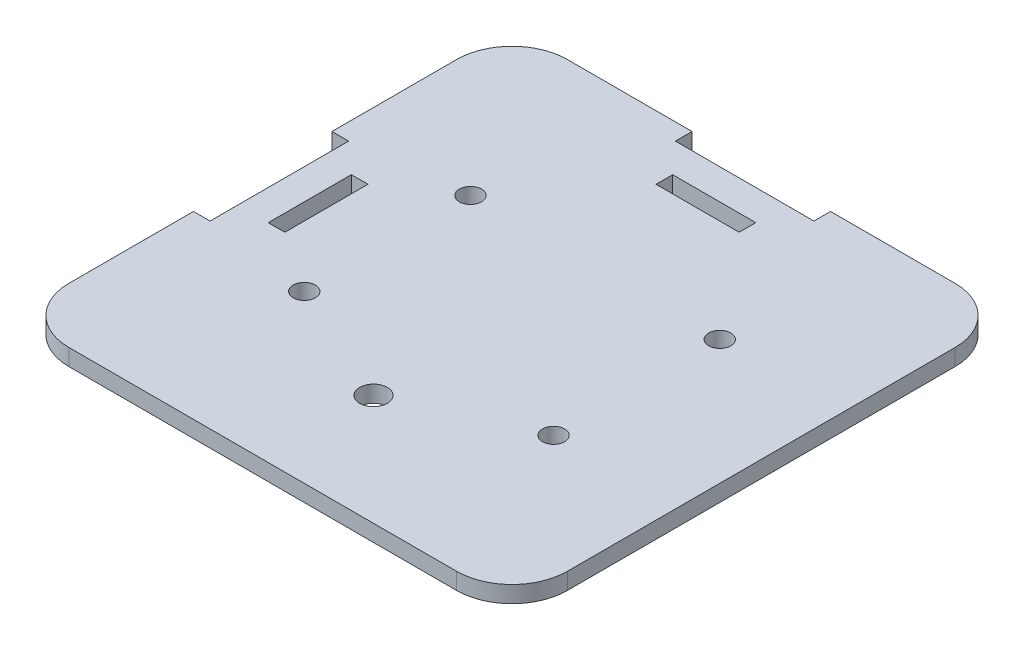
ISO-10303-21;
HEADER;
FILE_DESCRIPTION(('STEP AP214'),'2;1');
FILE_NAME('part.step','',(''),(''),'','','');
FILE_SCHEMA(('AUTOMOTIVE_DESIGN { 1 0 10303 214 1 1 1 1 }'));
ENDSEC;
DATA;
#1=APPLICATION_CONTEXT('core data for automotive mechanical design processes');
#2=APPLICATION_PROTOCOL_DEFINITION('international standard','automotive_design',2000,#1);
#3=PRODUCT_CONTEXT('',#1,'mechanical');
#4=PRODUCT('Part','Part','',(#3));
#5=PRODUCT_RELATED_PRODUCT_CATEGORY('part','',(#4));
#6=PRODUCT_DEFINITION_FORMATION('','',#4);
#7=PRODUCT_DEFINITION_CONTEXT('part definition',#1,'design');
#8=PRODUCT_DEFINITION('design','',#6,#7);
#9=PRODUCT_DEFINITION_SHAPE('','',#8);
#10=(LENGTH_UNIT() NAMED_UNIT(*) SI_UNIT(.MILLI.,.METRE.));
#11=(NAMED_UNIT(*) PLANE_ANGLE_UNIT() SI_UNIT($,.RADIAN.));
#12=(NAMED_UNIT(*) SI_UNIT($,.STERADIAN.) SOLID_ANGLE_UNIT());
#13=UNCERTAINTY_MEASURE_WITH_UNIT(LENGTH_MEASURE(1.E-05),#10,'distance_accuracy_value','');
#14=(GEOMETRIC_REPRESENTATION_CONTEXT(3) GLOBAL_UNCERTAINTY_ASSIGNED_CONTEXT((#13)) GLOBAL_UNIT_ASSIGNED_CONTEXT((#10,
#11,#12)) REPRESENTATION_CONTEXT('',''));
#15=CARTESIAN_POINT('',(0.,0.,0.));
#16=DIRECTION('',(0.,0.,1.));
#17=DIRECTION('',(1.,0.,0.));
#18=AXIS2_PLACEMENT_3D('',#15,#16,#17);
#19=CARTESIAN_POINT('',(-35.,3.,-35.));
#20=DIRECTION('',(0.,-1.,0.));
#21=DIRECTION('',(0.,0.,-1.));
#22=AXIS2_PLACEMENT_3D('',#19,#20,#21);
#23=CYLINDRICAL_SURFACE('',#22,10.);
#24=CARTESIAN_POINT('',(-35.,0.,-35.));
#25=DIRECTION('',(0.,1.,0.));
#26=DIRECTION('',(0.,0.,1.));
#27=AXIS2_PLACEMENT_3D('',#24,#25,#26);
#28=CIRCLE('',#27,10.);
#29=CARTESIAN_POINT('',(-45.,0.,-35.));
#30=VERTEX_POINT('',#29);
#31=CARTESIAN_POINT('',(-35.,0.,-45.));
#32=VERTEX_POINT('',#31);
#33=EDGE_CURVE('E269',#30,#32,#28,.F.);
#34=ORIENTED_EDGE('',*,*,#33,.F.);
#35=DIRECTION('',(0.,-1.,0.));
#36=VECTOR('',#35,1.);
#37=CARTESIAN_POINT('',(-45.,3.,-35.));
#38=LINE('',#37,#36);
#39=CARTESIAN_POINT('',(-45.,3.,-35.));
#40=VERTEX_POINT('',#39);
#41=EDGE_CURVE('E381',#40,#30,#38,.T.);
#42=ORIENTED_EDGE('',*,*,#41,.F.);
#43=CARTESIAN_POINT('',(-35.,3.,-35.));
#44=DIRECTION('',(0.,1.,0.));
#45=DIRECTION('',(0.,0.,1.));
#46=AXIS2_PLACEMENT_3D('',#43,#44,#45);
#47=CIRCLE('',#46,10.);
#48=CARTESIAN_POINT('',(-35.,3.,-45.));
#49=VERTEX_POINT('',#48);
#50=EDGE_CURVE('E272',#40,#49,#47,.F.);
#51=ORIENTED_EDGE('',*,*,#50,.T.);
#52=DIRECTION('',(0.,-1.,0.));
#53=VECTOR('',#52,1.);
#54=CARTESIAN_POINT('',(-35.,3.,-45.));
#55=LINE('',#54,#53);
#56=EDGE_CURVE('E346',#49,#32,#55,.T.);
#57=ORIENTED_EDGE('',*,*,#56,.T.);
#58=EDGE_LOOP('',(#34,#42,#51,#57));
#59=FACE_BOUND('',#58,.T.);
#60=ADVANCED_FACE('F35',(#59),#23,.T.);
#61=CARTESIAN_POINT('',(-45.,3.,0.));
#62=DIRECTION('',(-1.,0.,0.));
#63=DIRECTION('',(0.,0.,1.));
#64=AXIS2_PLACEMENT_3D('',#61,#62,#63);
#65=PLANE('',#64);
#66=DIRECTION('',(0.,0.,-1.));
#67=VECTOR('',#66,1.);
#68=CARTESIAN_POINT('',(-45.,0.,0.));
#69=LINE('',#68,#67);
#70=CARTESIAN_POINT('',(-45.,0.,-12.5));
#71=VERTEX_POINT('',#70);
#72=EDGE_CURVE('E311',#71,#30,#69,.T.);
#73=ORIENTED_EDGE('',*,*,#72,.F.);
#74=DIRECTION('',(0.,-1.,0.));
#75=VECTOR('',#74,1.);
#76=CARTESIAN_POINT('',(-45.,3.,-12.5));
#77=LINE('',#76,#75);
#78=CARTESIAN_POINT('',(-45.,3.,-12.5));
#79=VERTEX_POINT('',#78);
#80=EDGE_CURVE('E379',#79,#71,#77,.T.);
#81=ORIENTED_EDGE('',*,*,#80,.F.);
#82=DIRECTION('',(0.,0.,-1.));
#83=VECTOR('',#82,1.);
#84=CARTESIAN_POINT('',(-45.,3.,0.));
#85=LINE('',#84,#83);
#86=EDGE_CURVE('E275',#79,#40,#85,.T.);
#87=ORIENTED_EDGE('',*,*,#86,.T.);
#88=ORIENTED_EDGE('',*,*,#41,.T.);
#89=EDGE_LOOP('',(#73,#81,#87,#88));
#90=FACE_BOUND('',#89,.T.);
#91=ADVANCED_FACE('F420',(#90),#65,.T.);
#92=CARTESIAN_POINT('',(0.,3.,-12.5));
#93=DIRECTION('',(0.,0.,-1.));
#94=DIRECTION('',(-1.,0.,0.));
#95=AXIS2_PLACEMENT_3D('',#92,#93,#94);
#96=PLANE('',#95);
#97=DIRECTION('',(1.,0.,0.));
#98=VECTOR('',#97,1.);
#99=CARTESIAN_POINT('',(0.,0.,-12.5));
#100=LINE('',#99,#98);
#101=CARTESIAN_POINT('',(-42.,0.,-12.5));
#102=VERTEX_POINT('',#101);
#103=EDGE_CURVE('E314',#71,#102,#100,.T.);
#104=ORIENTED_EDGE('',*,*,#103,.T.);
#105=DIRECTION('',(0.,-1.,0.));
#106=VECTOR('',#105,1.);
#107=CARTESIAN_POINT('',(-42.,3.,-12.5));
#108=LINE('',#107,#106);
#109=CARTESIAN_POINT('',(-42.,3.,-12.5));
#110=VERTEX_POINT('',#109);
#111=EDGE_CURVE('E376',#110,#102,#108,.T.);
#112=ORIENTED_EDGE('',*,*,#111,.F.);
#113=DIRECTION('',(1.,0.,0.));
#114=VECTOR('',#113,1.);
#115=CARTESIAN_POINT('',(0.,3.,-12.5));
#116=LINE('',#115,#114);
#117=EDGE_CURVE('E279',#79,#110,#116,.T.);
#118=ORIENTED_EDGE('',*,*,#117,.F.);
#119=ORIENTED_EDGE('',*,*,#80,.T.);
#120=EDGE_LOOP('',(#104,#112,#118,#119));
#121=FACE_BOUND('',#120,.T.);
#122=ADVANCED_FACE('F425',(#121),#96,.F.);
#123=CARTESIAN_POINT('',(-42.,3.,0.));
#124=DIRECTION('',(1.,0.,0.));
#125=DIRECTION('',(0.,0.,-1.));
#126=AXIS2_PLACEMENT_3D('',#123,#124,#125);
#127=PLANE('',#126);
#128=DIRECTION('',(0.,0.,1.));
#129=VECTOR('',#128,1.);
#130=CARTESIAN_POINT('',(-42.,0.,0.));
#131=LINE('',#130,#129);
#132=CARTESIAN_POINT('',(-42.,0.,12.5));
#133=VERTEX_POINT('',#132);
#134=EDGE_CURVE('E317',#102,#133,#131,.T.);
#135=ORIENTED_EDGE('',*,*,#134,.T.);
#136=DIRECTION('',(0.,-1.,0.));
#137=VECTOR('',#136,1.);
#138=CARTESIAN_POINT('',(-42.,3.,12.5));
#139=LINE('',#138,#137);
#140=CARTESIAN_POINT('',(-42.,3.,12.5));
#141=VERTEX_POINT('',#140);
#142=EDGE_CURVE('E374',#141,#133,#139,.T.);
#143=ORIENTED_EDGE('',*,*,#142,.F.);
#144=DIRECTION('',(0.,0.,1.));
#145=VECTOR('',#144,1.);
#146=CARTESIAN_POINT('',(-42.,3.,0.));
#147=LINE('',#146,#145);
#148=EDGE_CURVE('E282',#110,#141,#147,.T.);
#149=ORIENTED_EDGE('',*,*,#148,.F.);
#150=ORIENTED_EDGE('',*,*,#111,.T.);
#151=EDGE_LOOP('',(#135,#143,#149,#150));
#152=FACE_BOUND('',#151,.T.);
#153=ADVANCED_FACE('F497',(#152),#127,.F.);
#154=CARTESIAN_POINT('',(0.,3.,12.5));
#155=DIRECTION('',(0.,0.,-1.));
#156=DIRECTION('',(-1.,0.,0.));
#157=AXIS2_PLACEMENT_3D('',#154,#155,#156);
#158=PLANE('',#157);
#159=DIRECTION('',(1.,0.,0.));
#160=VECTOR('',#159,1.);
#161=CARTESIAN_POINT('',(0.,0.,12.5));
#162=LINE('',#161,#160);
#163=CARTESIAN_POINT('',(-45.,0.,12.5));
#164=VERTEX_POINT('',#163);
#165=EDGE_CURVE('E320',#164,#133,#162,.T.);
#166=ORIENTED_EDGE('',*,*,#165,.F.);
#167=DIRECTION('',(0.,-1.,0.));
#168=VECTOR('',#167,1.);
#169=CARTESIAN_POINT('',(-45.,3.,12.5));
#170=LINE('',#169,#168);
#171=CARTESIAN_POINT('',(-45.,3.,12.5));
#172=VERTEX_POINT('',#171);
#173=EDGE_CURVE('E372',#172,#164,#170,.T.);
#174=ORIENTED_EDGE('',*,*,#173,.F.);
#175=DIRECTION('',(1.,0.,0.));
#176=VECTOR('',#175,1.);
#177=CARTESIAN_POINT('',(0.,3.,12.5));
#178=LINE('',#177,#176);
#179=EDGE_CURVE('E284',#172,#141,#178,.T.);
#180=ORIENTED_EDGE('',*,*,#179,.T.);
#181=ORIENTED_EDGE('',*,*,#142,.T.);
#182=EDGE_LOOP('',(#166,#174,#180,#181));
#183=FACE_BOUND('',#182,.T.);
#184=ADVANCED_FACE('F494',(#183),#158,.T.);
#185=CARTESIAN_POINT('',(-45.,0.,35.));
#186=VERTEX_POINT('',#185);
#187=EDGE_CURVE('E315',#186,#164,#69,.T.);
#188=ORIENTED_EDGE('',*,*,#187,.F.);
#189=DIRECTION('',(0.,-1.,0.));
#190=VECTOR('',#189,1.);
#191=CARTESIAN_POINT('',(-45.,3.,35.));
#192=LINE('',#191,#190);
#193=CARTESIAN_POINT('',(-45.,3.,35.));
#194=VERTEX_POINT('',#193);
#195=EDGE_CURVE('E370',#194,#186,#192,.T.);
#196=ORIENTED_EDGE('',*,*,#195,.F.);
#197=EDGE_CURVE('E280',#194,#172,#85,.T.);
#198=ORIENTED_EDGE('',*,*,#197,.T.);
#199=ORIENTED_EDGE('',*,*,#173,.T.);
#200=EDGE_LOOP('',(#188,#196,#198,#199));
#201=FACE_BOUND('',#200,.T.);
#202=ADVANCED_FACE('F428',(#201),#65,.T.);
#203=CARTESIAN_POINT('',(-35.,3.,35.));
#204=DIRECTION('',(0.,-1.,0.));
#205=DIRECTION('',(0.,0.,-1.));
#206=AXIS2_PLACEMENT_3D('',#203,#204,#205);
#207=CYLINDRICAL_SURFACE('',#206,10.);
#208=CARTESIAN_POINT('',(-35.,0.,35.));
#209=DIRECTION('',(0.,1.,0.));
#210=DIRECTION('',(0.,0.,1.));
#211=AXIS2_PLACEMENT_3D('',#208,#209,#210);
#212=CIRCLE('',#211,10.);
#213=CARTESIAN_POINT('',(-35.,0.,45.));
#214=VERTEX_POINT('',#213);
#215=EDGE_CURVE('E323',#186,#214,#212,.T.);
#216=ORIENTED_EDGE('',*,*,#215,.T.);
#217=DIRECTION('',(0.,-1.,0.));
#218=VECTOR('',#217,1.);
#219=CARTESIAN_POINT('',(-35.,3.,45.));
#220=LINE('',#219,#218);
#221=CARTESIAN_POINT('',(-35.,3.,45.));
#222=VERTEX_POINT('',#221);
#223=EDGE_CURVE('E368',#222,#214,#220,.T.);
#224=ORIENTED_EDGE('',*,*,#223,.F.);
#225=CARTESIAN_POINT('',(-35.,3.,35.));
#226=DIRECTION('',(0.,1.,0.));
#227=DIRECTION('',(0.,0.,1.));
#228=AXIS2_PLACEMENT_3D('',#225,#226,#227);
#229=CIRCLE('',#228,10.);
#230=EDGE_CURVE('E287',#194,#222,#229,.T.);
#231=ORIENTED_EDGE('',*,*,#230,.F.);
#232=ORIENTED_EDGE('',*,*,#195,.T.);
#233=EDGE_LOOP('',(#216,#224,#231,#232));
#234=FACE_BOUND('',#233,.T.);
#235=ADVANCED_FACE('F509',(#234),#207,.T.);
#236=CARTESIAN_POINT('',(0.,3.,45.));
#237=DIRECTION('',(0.,0.,1.));
#238=DIRECTION('',(1.,0.,0.));
#239=AXIS2_PLACEMENT_3D('',#236,#237,#238);
#240=PLANE('',#239);
#241=DIRECTION('',(-1.,0.,0.));
#242=VECTOR('',#241,1.);
#243=CARTESIAN_POINT('',(0.,0.,45.));
#244=LINE('',#243,#242);
#245=CARTESIAN_POINT('',(35.,0.,45.));
#246=VERTEX_POINT('',#245);
#247=EDGE_CURVE('E326',#246,#214,#244,.T.);
#248=ORIENTED_EDGE('',*,*,#247,.F.);
#249=DIRECTION('',(0.,-1.,0.));
#250=VECTOR('',#249,1.);
#251=CARTESIAN_POINT('',(35.,3.,45.));
#252=LINE('',#251,#250);
#253=CARTESIAN_POINT('',(35.,3.,45.));
#254=VERTEX_POINT('',#253);
#255=EDGE_CURVE('E366',#254,#246,#252,.T.);
#256=ORIENTED_EDGE('',*,*,#255,.F.);
#257=DIRECTION('',(-1.,0.,0.));
#258=VECTOR('',#257,1.);
#259=CARTESIAN_POINT('',(0.,3.,45.));
#260=LINE('',#259,#258);
#261=EDGE_CURVE('E289',#254,#222,#260,.T.);
#262=ORIENTED_EDGE('',*,*,#261,.T.);
#263=ORIENTED_EDGE('',*,*,#223,.T.);
#264=EDGE_LOOP('',(#248,#256,#262,#263));
#265=FACE_BOUND('',#264,.T.);
#266=ADVANCED_FACE('F481',(#265),#240,.T.);
#267=CARTESIAN_POINT('',(35.,3.,35.));
#268=DIRECTION('',(0.,-1.,0.));
#269=DIRECTION('',(0.,0.,-1.));
#270=AXIS2_PLACEMENT_3D('',#267,#268,#269);
#271=CYLINDRICAL_SURFACE('',#270,10.);
#272=CARTESIAN_POINT('',(35.,0.,35.));
#273=DIRECTION('',(0.,1.,0.));
#274=DIRECTION('',(0.,0.,1.));
#275=AXIS2_PLACEMENT_3D('',#272,#273,#274);
#276=CIRCLE('',#275,10.);
#277=CARTESIAN_POINT('',(45.,0.,35.));
#278=VERTEX_POINT('',#277);
#279=EDGE_CURVE('E329',#246,#278,#276,.T.);
#280=ORIENTED_EDGE('',*,*,#279,.T.);
#281=DIRECTION('',(0.,-1.,0.));
#282=VECTOR('',#281,1.);
#283=CARTESIAN_POINT('',(45.,3.,35.));
#284=LINE('',#283,#282);
#285=CARTESIAN_POINT('',(45.,3.,35.));
#286=VERTEX_POINT('',#285);
#287=EDGE_CURVE('E363',#286,#278,#284,.T.);
#288=ORIENTED_EDGE('',*,*,#287,.F.);
#289=CARTESIAN_POINT('',(35.,3.,35.));
#290=DIRECTION('',(0.,1.,0.));
#291=DIRECTION('',(0.,0.,1.));
#292=AXIS2_PLACEMENT_3D('',#289,#290,#291);
#293=CIRCLE('',#292,10.);
#294=EDGE_CURVE('E292',#254,#286,#293,.T.);
#295=ORIENTED_EDGE('',*,*,#294,.F.);
#296=ORIENTED_EDGE('',*,*,#255,.T.);
#297=EDGE_LOOP('',(#280,#288,#295,#296));
#298=FACE_BOUND('',#297,.T.);
#299=ADVANCED_FACE('F478',(#298),#271,.T.);
#300=CARTESIAN_POINT('',(45.,3.,0.));
#301=DIRECTION('',(-1.,0.,0.));
#302=DIRECTION('',(0.,0.,1.));
#303=AXIS2_PLACEMENT_3D('',#300,#301,#302);
#304=PLANE('',#303);
#305=DIRECTION('',(0.,0.,-1.));
#306=VECTOR('',#305,1.);
#307=CARTESIAN_POINT('',(45.,0.,0.));
#308=LINE('',#307,#306);
#309=CARTESIAN_POINT('',(45.,0.,-35.));
#310=VERTEX_POINT('',#309);
#311=EDGE_CURVE('E331',#278,#310,#308,.T.);
#312=ORIENTED_EDGE('',*,*,#311,.T.);
#313=DIRECTION('',(0.,-1.,0.));
#314=VECTOR('',#313,1.);
#315=CARTESIAN_POINT('',(45.,3.,-35.));
#316=LINE('',#315,#314);
#317=CARTESIAN_POINT('',(45.,3.,-35.));
#318=VERTEX_POINT('',#317);
#319=EDGE_CURVE('E360',#318,#310,#316,.T.);
#320=ORIENTED_EDGE('',*,*,#319,.F.);
#321=DIRECTION('',(0.,0.,-1.));
#322=VECTOR('',#321,1.);
#323=CARTESIAN_POINT('',(45.,3.,0.));
#324=LINE('',#323,#322);
#325=EDGE_CURVE('E294',#286,#318,#324,.T.);
#326=ORIENTED_EDGE('',*,*,#325,.F.);
#327=ORIENTED_EDGE('',*,*,#287,.T.);
#328=EDGE_LOOP('',(#312,#320,#326,#327));
#329=FACE_BOUND('',#328,.T.);
#330=ADVANCED_FACE('F473',(#329),#304,.F.);
#331=CARTESIAN_POINT('',(35.,3.,-35.));
#332=DIRECTION('',(0.,-1.,0.));
#333=DIRECTION('',(0.,0.,-1.));
#334=AXIS2_PLACEMENT_3D('',#331,#332,#333);
#335=CYLINDRICAL_SURFACE('',#334,10.);
#336=CARTESIAN_POINT('',(35.,0.,-35.));
#337=DIRECTION('',(0.,1.,0.));
#338=DIRECTION('',(0.,0.,1.));
#339=AXIS2_PLACEMENT_3D('',#336,#337,#338);
#340=CIRCLE('',#339,10.);
#341=CARTESIAN_POINT('',(35.,0.,-45.));
#342=VERTEX_POINT('',#341);
#343=EDGE_CURVE('E333',#310,#342,#340,.T.);
#344=ORIENTED_EDGE('',*,*,#343,.T.);
#345=DIRECTION('',(0.,-1.,0.));
#346=VECTOR('',#345,1.);
#347=CARTESIAN_POINT('',(35.,3.,-45.));
#348=LINE('',#347,#346);
#349=CARTESIAN_POINT('',(35.,3.,-45.));
#350=VERTEX_POINT('',#349);
#351=EDGE_CURVE('E357',#350,#342,#348,.T.);
#352=ORIENTED_EDGE('',*,*,#351,.F.);
#353=CARTESIAN_POINT('',(35.,3.,-35.));
#354=DIRECTION('',(0.,1.,0.));
#355=DIRECTION('',(0.,0.,1.));
#356=AXIS2_PLACEMENT_3D('',#353,#354,#355);
#357=CIRCLE('',#356,10.);
#358=EDGE_CURVE('E296',#318,#350,#357,.T.);
#359=ORIENTED_EDGE('',*,*,#358,.F.);
#360=ORIENTED_EDGE('',*,*,#319,.T.);
#361=EDGE_LOOP('',(#344,#352,#359,#360));
#362=FACE_BOUND('',#361,.T.);
#363=ADVANCED_FACE('F467',(#362),#335,.T.);
#364=CARTESIAN_POINT('',(0.,3.,-45.));
#365=DIRECTION('',(0.,0.,1.));
#366=DIRECTION('',(1.,0.,0.));
#367=AXIS2_PLACEMENT_3D('',#364,#365,#366);
#368=PLANE('',#367);
#369=DIRECTION('',(-1.,0.,0.));
#370=VECTOR('',#369,1.);
#371=CARTESIAN_POINT('',(0.,0.,-45.));
#372=LINE('',#371,#370);
#373=CARTESIAN_POINT('',(12.5,0.,-45.));
#374=VERTEX_POINT('',#373);
#375=EDGE_CURVE('E335',#342,#374,#372,.T.);
#376=ORIENTED_EDGE('',*,*,#375,.T.);
#377=DIRECTION('',(0.,-1.,0.));
#378=VECTOR('',#377,1.);
#379=CARTESIAN_POINT('',(12.5,3.,-45.));
#380=LINE('',#379,#378);
#381=CARTESIAN_POINT('',(12.5,3.,-45.));
#382=VERTEX_POINT('',#381);
#383=EDGE_CURVE('E354',#382,#374,#380,.T.);
#384=ORIENTED_EDGE('',*,*,#383,.F.);
#385=DIRECTION('',(-1.,0.,0.));
#386=VECTOR('',#385,1.);
#387=CARTESIAN_POINT('',(0.,3.,-45.));
#388=LINE('',#387,#386);
#389=EDGE_CURVE('E298',#350,#382,#388,.T.);
#390=ORIENTED_EDGE('',*,*,#389,.F.);
#391=ORIENTED_EDGE('',*,*,#351,.T.);
#392=EDGE_LOOP('',(#376,#384,#390,#391));
#393=FACE_BOUND('',#392,.T.);
#394=ADVANCED_FACE('F463',(#393),#368,.F.);
#395=CARTESIAN_POINT('',(12.5,3.,0.));
#396=DIRECTION('',(1.,0.,0.));
#397=DIRECTION('',(0.,0.,-1.));
#398=AXIS2_PLACEMENT_3D('',#395,#396,#397);
#399=PLANE('',#398);
#400=DIRECTION('',(0.,0.,1.));
#401=VECTOR('',#400,1.);
#402=CARTESIAN_POINT('',(12.5,0.,0.));
#403=LINE('',#402,#401);
#404=CARTESIAN_POINT('',(12.5,0.,-42.));
#405=VERTEX_POINT('',#404);
#406=EDGE_CURVE('E337',#374,#405,#403,.T.);
#407=ORIENTED_EDGE('',*,*,#406,.T.);
#408=DIRECTION('',(0.,-1.,0.));
#409=VECTOR('',#408,1.);
#410=CARTESIAN_POINT('',(12.5,3.,-42.));
#411=LINE('',#410,#409);
#412=CARTESIAN_POINT('',(12.5,3.,-42.));
#413=VERTEX_POINT('',#412);
#414=EDGE_CURVE('E352',#413,#405,#411,.T.);
#415=ORIENTED_EDGE('',*,*,#414,.F.);
#416=DIRECTION('',(0.,0.,1.));
#417=VECTOR('',#416,1.);
#418=CARTESIAN_POINT('',(12.5,3.,0.));
#419=LINE('',#418,#417);
#420=EDGE_CURVE('E300',#382,#413,#419,.T.);
#421=ORIENTED_EDGE('',*,*,#420,.F.);
#422=ORIENTED_EDGE('',*,*,#383,.T.);
#423=EDGE_LOOP('',(#407,#415,#421,#422));
#424=FACE_BOUND('',#423,.T.);
#425=ADVANCED_FACE('F458',(#424),#399,.F.);
#426=CARTESIAN_POINT('',(0.,3.,-42.));
#427=DIRECTION('',(0.,0.,-1.));
#428=DIRECTION('',(-1.,0.,0.));
#429=AXIS2_PLACEMENT_3D('',#426,#427,#428);
#430=PLANE('',#429);
#431=DIRECTION('',(1.,0.,0.));
#432=VECTOR('',#431,1.);
#433=CARTESIAN_POINT('',(0.,0.,-42.));
#434=LINE('',#433,#432);
#435=CARTESIAN_POINT('',(-12.5,0.,-42.));
#436=VERTEX_POINT('',#435);
#437=EDGE_CURVE('E340',#436,#405,#434,.T.);
#438=ORIENTED_EDGE('',*,*,#437,.F.);
#439=DIRECTION('',(0.,-1.,0.));
#440=VECTOR('',#439,1.);
#441=CARTESIAN_POINT('',(-12.5,3.,-42.));
#442=LINE('',#441,#440);
#443=CARTESIAN_POINT('',(-12.5,3.,-42.));
#444=VERTEX_POINT('',#443);
#445=EDGE_CURVE('E350',#444,#436,#442,.T.);
#446=ORIENTED_EDGE('',*,*,#445,.F.);
#447=DIRECTION('',(1.,0.,0.));
#448=VECTOR('',#447,1.);
#449=CARTESIAN_POINT('',(0.,3.,-42.));
#450=LINE('',#449,#448);
#451=EDGE_CURVE('E303',#444,#413,#450,.T.);
#452=ORIENTED_EDGE('',*,*,#451,.T.);
#453=ORIENTED_EDGE('',*,*,#414,.T.);
#454=EDGE_LOOP('',(#438,#446,#452,#453));
#455=FACE_BOUND('',#454,.T.);
#456=ADVANCED_FACE('F452',(#455),#430,.T.);
#457=CARTESIAN_POINT('',(-12.5,3.,0.));
#458=DIRECTION('',(1.,0.,0.));
#459=DIRECTION('',(0.,0.,-1.));
#460=AXIS2_PLACEMENT_3D('',#457,#458,#459);
#461=PLANE('',#460);
#462=DIRECTION('',(0.,0.,1.));
#463=VECTOR('',#462,1.);
#464=CARTESIAN_POINT('',(-12.5,0.,0.));
#465=LINE('',#464,#463);
#466=CARTESIAN_POINT('',(-12.5,0.,-45.));
#467=VERTEX_POINT('',#466);
#468=EDGE_CURVE('E343',#467,#436,#465,.T.);
#469=ORIENTED_EDGE('',*,*,#468,.F.);
#470=DIRECTION('',(0.,-1.,0.));
#471=VECTOR('',#470,1.);
#472=CARTESIAN_POINT('',(-12.5,3.,-45.));
#473=LINE('',#472,#471);
#474=CARTESIAN_POINT('',(-12.5,3.,-45.));
#475=VERTEX_POINT('',#474);
#476=EDGE_CURVE('E348',#475,#467,#473,.T.);
#477=ORIENTED_EDGE('',*,*,#476,.F.);
#478=DIRECTION('',(0.,0.,1.));
#479=VECTOR('',#478,1.);
#480=CARTESIAN_POINT('',(-12.5,3.,0.));
#481=LINE('',#480,#479);
#482=EDGE_CURVE('E306',#475,#444,#481,.T.);
#483=ORIENTED_EDGE('',*,*,#482,.T.);
#484=ORIENTED_EDGE('',*,*,#445,.T.);
#485=EDGE_LOOP('',(#469,#477,#483,#484));
#486=FACE_BOUND('',#485,.T.);
#487=ADVANCED_FACE('F449',(#486),#461,.T.);
#488=EDGE_CURVE('E276',#467,#32,#372,.T.);
#489=ORIENTED_EDGE('',*,*,#488,.T.);
#490=ORIENTED_EDGE('',*,*,#56,.F.);
#491=EDGE_CURVE('E301',#475,#49,#388,.T.);
#492=ORIENTED_EDGE('',*,*,#491,.F.);
#493=ORIENTED_EDGE('',*,*,#476,.T.);
#494=EDGE_LOOP('',(#489,#490,#492,#493));
#495=FACE_BOUND('',#494,.T.);
#496=ADVANCED_FACE('F446',(#495),#368,.F.);
#497=CARTESIAN_POINT('',(0.,3.,0.));
#498=DIRECTION('',(0.,1.,0.));
#499=DIRECTION('',(0.,0.,1.));
#500=AXIS2_PLACEMENT_3D('',#497,#498,#499);
#501=PLANE('',#500);
#502=CARTESIAN_POINT('',(0.,3.,25.));
#503=DIRECTION('',(0.,1.,0.));
#504=DIRECTION('',(0.,0.,1.));
#505=AXIS2_PLACEMENT_3D('',#502,#503,#504);
#506=CIRCLE('',#505,2.5);
#507=CARTESIAN_POINT('',(0.,3.,27.5));
#508=VERTEX_POINT('',#507);
#509=EDGE_CURVE('E646',#508,#508,#506,.T.);
#510=ORIENTED_EDGE('',*,*,#509,.F.);
#511=EDGE_LOOP('',(#510));
#512=FACE_BOUND('',#511,.T.);
#513=DIRECTION('',(0.,0.,1.));
#514=VECTOR('',#513,1.);
#515=CARTESIAN_POINT('',(-7.5,3.,-33.5));
#516=LINE('',#515,#514);
#517=CARTESIAN_POINT('',(-7.5,3.,-36.5));
#518=VERTEX_POINT('',#517);
#519=CARTESIAN_POINT('',(-7.5,3.,-33.5));
#520=VERTEX_POINT('',#519);
#521=EDGE_CURVE('E50',#518,#520,#516,.T.);
#522=ORIENTED_EDGE('',*,*,#521,.F.);
#523=DIRECTION('',(-1.,0.,0.));
#524=VECTOR('',#523,1.);
#525=CARTESIAN_POINT('',(7.5,3.,-36.5));
#526=LINE('',#525,#524);
#527=CARTESIAN_POINT('',(7.5,3.,-36.5));
#528=VERTEX_POINT('',#527);
#529=EDGE_CURVE('E220',#528,#518,#526,.T.);
#530=ORIENTED_EDGE('',*,*,#529,.F.);
#531=DIRECTION('',(0.,0.,-1.));
#532=VECTOR('',#531,1.);
#533=CARTESIAN_POINT('',(7.5,3.,-33.5));
#534=LINE('',#533,#532);
#535=CARTESIAN_POINT('',(7.5,3.,-33.5));
#536=VERTEX_POINT('',#535);
#537=EDGE_CURVE('E203',#536,#528,#534,.T.);
#538=ORIENTED_EDGE('',*,*,#537,.F.);
#539=DIRECTION('',(1.,0.,0.));
#540=VECTOR('',#539,1.);
#541=CARTESIAN_POINT('',(7.5,3.,-33.5));
#542=LINE('',#541,#540);
#543=EDGE_CURVE('E213',#520,#536,#542,.T.);
#544=ORIENTED_EDGE('',*,*,#543,.F.);
#545=EDGE_LOOP('',(#522,#530,#538,#544));
#546=FACE_BOUND('',#545,.T.);
#547=DIRECTION('',(0.,0.,-1.));
#548=VECTOR('',#547,1.);
#549=CARTESIAN_POINT('',(-33.5,3.,7.5));
#550=LINE('',#549,#548);
#551=CARTESIAN_POINT('',(-33.5,3.,7.5));
#552=VERTEX_POINT('',#551);
#553=CARTESIAN_POINT('',(-33.5,3.,-7.5));
#554=VERTEX_POINT('',#553);
#555=EDGE_CURVE('E58',#552,#554,#550,.T.);
#556=ORIENTED_EDGE('',*,*,#555,.F.);
#557=DIRECTION('',(1.,0.,0.));
#558=VECTOR('',#557,1.);
#559=CARTESIAN_POINT('',(-36.5,3.,7.5));
#560=LINE('',#559,#558);
#561=CARTESIAN_POINT('',(-36.5,3.,7.5));
#562=VERTEX_POINT('',#561);
#563=EDGE_CURVE('E237',#562,#552,#560,.T.);
#564=ORIENTED_EDGE('',*,*,#563,.F.);
#565=DIRECTION('',(0.,0.,1.));
#566=VECTOR('',#565,1.);
#567=CARTESIAN_POINT('',(-36.5,3.,7.5));
#568=LINE('',#567,#566);
#569=CARTESIAN_POINT('',(-36.5,3.,-7.5));
#570=VERTEX_POINT('',#569);
#571=EDGE_CURVE('E234',#570,#562,#568,.T.);
#572=ORIENTED_EDGE('',*,*,#571,.F.);
#573=DIRECTION('',(-1.,0.,0.));
#574=VECTOR('',#573,1.);
#575=CARTESIAN_POINT('',(-36.5,3.,-7.5));
#576=LINE('',#575,#574);
#577=EDGE_CURVE('E231',#554,#570,#576,.T.);
#578=ORIENTED_EDGE('',*,*,#577,.F.);
#579=EDGE_LOOP('',(#556,#564,#572,#578));
#580=FACE_BOUND('',#579,.T.);
#581=CARTESIAN_POINT('',(-22.5,3.,15.));
#582=DIRECTION('',(0.,1.,0.));
#583=DIRECTION('',(0.,0.,-1.));
#584=AXIS2_PLACEMENT_3D('',#581,#582,#583);
#585=CIRCLE('',#584,2.00000000000001);
#586=CARTESIAN_POINT('',(-22.5,3.,13.));
#587=VERTEX_POINT('',#586);
#588=EDGE_CURVE('E227',#587,#587,#585,.T.);
#589=ORIENTED_EDGE('',*,*,#588,.F.);
#590=EDGE_LOOP('',(#589));
#591=FACE_BOUND('',#590,.T.);
#592=CARTESIAN_POINT('',(22.5,3.,15.));
#593=DIRECTION('',(0.,1.,0.));
#594=DIRECTION('',(0.,0.,1.));
#595=AXIS2_PLACEMENT_3D('',#592,#593,#594);
#596=CIRCLE('',#595,2.00000000000001);
#597=CARTESIAN_POINT('',(22.5,3.,17.));
#598=VERTEX_POINT('',#597);
#599=EDGE_CURVE('E258',#598,#598,#596,.T.);
#600=ORIENTED_EDGE('',*,*,#599,.F.);
#601=EDGE_LOOP('',(#600));
#602=FACE_BOUND('',#601,.T.);
#603=CARTESIAN_POINT('',(22.5,3.,-15.));
#604=DIRECTION('',(0.,1.,0.));
#605=DIRECTION('',(0.,0.,-1.));
#606=AXIS2_PLACEMENT_3D('',#603,#604,#605);
#607=CIRCLE('',#606,2.00000000000001);
#608=CARTESIAN_POINT('',(22.5,3.,-17.));
#609=VERTEX_POINT('',#608);
#610=EDGE_CURVE('E252',#609,#609,#607,.T.);
#611=ORIENTED_EDGE('',*,*,#610,.F.);
#612=EDGE_LOOP('',(#611));
#613=FACE_BOUND('',#612,.T.);
#614=CARTESIAN_POINT('',(-22.5,3.,-15.));
#615=DIRECTION('',(0.,1.,0.));
#616=DIRECTION('',(0.,0.,1.));
#617=AXIS2_PLACEMENT_3D('',#614,#615,#616);
#618=CIRCLE('',#617,2.00000000000001);
#619=CARTESIAN_POINT('',(-22.5,3.,-13.));
#620=VERTEX_POINT('',#619);
#621=EDGE_CURVE('E251',#620,#620,#618,.T.);
#622=ORIENTED_EDGE('',*,*,#621,.F.);
#623=EDGE_LOOP('',(#622));
#624=FACE_BOUND('',#623,.T.);
#625=ORIENTED_EDGE('',*,*,#50,.F.);
#626=ORIENTED_EDGE('',*,*,#86,.F.);
#627=ORIENTED_EDGE('',*,*,#117,.T.);
#628=ORIENTED_EDGE('',*,*,#148,.T.);
#629=ORIENTED_EDGE('',*,*,#179,.F.);
#630=ORIENTED_EDGE('',*,*,#197,.F.);
#631=ORIENTED_EDGE('',*,*,#230,.T.);
#632=ORIENTED_EDGE('',*,*,#261,.F.);
#633=ORIENTED_EDGE('',*,*,#294,.T.);
#634=ORIENTED_EDGE('',*,*,#325,.T.);
#635=ORIENTED_EDGE('',*,*,#358,.T.);
#636=ORIENTED_EDGE('',*,*,#389,.T.);
#637=ORIENTED_EDGE('',*,*,#420,.T.);
#638=ORIENTED_EDGE('',*,*,#451,.F.);
#639=ORIENTED_EDGE('',*,*,#482,.F.);
#640=ORIENTED_EDGE('',*,*,#491,.T.);
#641=EDGE_LOOP('',(#625,#626,#627,#628,#629,#630,#631,#632,#633,#634,#635,#636,#637,#638,#639,#640));
#642=FACE_BOUND('',#641,.T.);
#643=ADVANCED_FACE('F217',(#512,#546,#580,#591,#602,#613,#624,#642),#501,.T.);
#644=CARTESIAN_POINT('',(0.,0.,0.));
#645=DIRECTION('',(0.,1.,0.));
#646=DIRECTION('',(0.,0.,1.));
#647=AXIS2_PLACEMENT_3D('',#644,#645,#646);
#648=PLANE('',#647);
#649=CARTESIAN_POINT('',(0.,0.,25.));
#650=DIRECTION('',(0.,1.,0.));
#651=DIRECTION('',(0.,0.,1.));
#652=AXIS2_PLACEMENT_3D('',#649,#650,#651);
#653=CIRCLE('',#652,2.5);
#654=CARTESIAN_POINT('',(0.,0.,27.5));
#655=VERTEX_POINT('',#654);
#656=EDGE_CURVE('E38',#655,#655,#653,.T.);
#657=ORIENTED_EDGE('',*,*,#656,.T.);
#658=EDGE_LOOP('',(#657));
#659=FACE_BOUND('',#658,.T.);
#660=DIRECTION('',(-1.,0.,0.));
#661=VECTOR('',#660,1.);
#662=CARTESIAN_POINT('',(0.,0.,-36.5));
#663=LINE('',#662,#661);
#664=CARTESIAN_POINT('',(7.5,0.,-36.5));
#665=VERTEX_POINT('',#664);
#666=CARTESIAN_POINT('',(-7.5,0.,-36.5));
#667=VERTEX_POINT('',#666);
#668=EDGE_CURVE('E43',#665,#667,#663,.T.);
#669=ORIENTED_EDGE('',*,*,#668,.T.);
#670=DIRECTION('',(0.,0.,1.));
#671=VECTOR('',#670,1.);
#672=CARTESIAN_POINT('',(-7.5,0.,0.));
#673=LINE('',#672,#671);
#674=CARTESIAN_POINT('',(-7.5,0.,-33.5));
#675=VERTEX_POINT('',#674);
#676=EDGE_CURVE('E11',#667,#675,#673,.T.);
#677=ORIENTED_EDGE('',*,*,#676,.T.);
#678=DIRECTION('',(1.,0.,0.));
#679=VECTOR('',#678,1.);
#680=CARTESIAN_POINT('',(0.,0.,-33.5));
#681=LINE('',#680,#679);
#682=CARTESIAN_POINT('',(7.5,0.,-33.5));
#683=VERTEX_POINT('',#682);
#684=EDGE_CURVE('E395',#675,#683,#681,.T.);
#685=ORIENTED_EDGE('',*,*,#684,.T.);
#686=DIRECTION('',(0.,0.,-1.));
#687=VECTOR('',#686,1.);
#688=CARTESIAN_POINT('',(7.5,0.,0.));
#689=LINE('',#688,#687);
#690=EDGE_CURVE('E206',#683,#665,#689,.T.);
#691=ORIENTED_EDGE('',*,*,#690,.T.);
#692=EDGE_LOOP('',(#669,#677,#685,#691));
#693=FACE_BOUND('',#692,.T.);
#694=DIRECTION('',(1.,0.,0.));
#695=VECTOR('',#694,1.);
#696=CARTESIAN_POINT('',(0.,0.,7.5));
#697=LINE('',#696,#695);
#698=CARTESIAN_POINT('',(-36.5,0.,7.5));
#699=VERTEX_POINT('',#698);
#700=CARTESIAN_POINT('',(-33.5,0.,7.5));
#701=VERTEX_POINT('',#700);
#702=EDGE_CURVE('E389',#699,#701,#697,.T.);
#703=ORIENTED_EDGE('',*,*,#702,.T.);
#704=DIRECTION('',(0.,0.,-1.));
#705=VECTOR('',#704,1.);
#706=CARTESIAN_POINT('',(-33.5,0.,0.));
#707=LINE('',#706,#705);
#708=CARTESIAN_POINT('',(-33.5,0.,-7.5));
#709=VERTEX_POINT('',#708);
#710=EDGE_CURVE('E392',#701,#709,#707,.T.);
#711=ORIENTED_EDGE('',*,*,#710,.T.);
#712=DIRECTION('',(-1.,0.,0.));
#713=VECTOR('',#712,1.);
#714=CARTESIAN_POINT('',(0.,0.,-7.5));
#715=LINE('',#714,#713);
#716=CARTESIAN_POINT('',(-36.5,0.,-7.5));
#717=VERTEX_POINT('',#716);
#718=EDGE_CURVE('E383',#709,#717,#715,.T.);
#719=ORIENTED_EDGE('',*,*,#718,.T.);
#720=DIRECTION('',(0.,0.,1.));
#721=VECTOR('',#720,1.);
#722=CARTESIAN_POINT('',(-36.5,0.,0.));
#723=LINE('',#722,#721);
#724=EDGE_CURVE('E386',#717,#699,#723,.T.);
#725=ORIENTED_EDGE('',*,*,#724,.T.);
#726=EDGE_LOOP('',(#703,#711,#719,#725));
#727=FACE_BOUND('',#726,.T.);
#728=CARTESIAN_POINT('',(-22.5,0.,15.));
#729=DIRECTION('',(0.,1.,0.));
#730=DIRECTION('',(0.,0.,-1.));
#731=AXIS2_PLACEMENT_3D('',#728,#729,#730);
#732=CIRCLE('',#731,2.00000000000001);
#733=CARTESIAN_POINT('',(-22.5,0.,13.));
#734=VERTEX_POINT('',#733);
#735=EDGE_CURVE('E261',#734,#734,#732,.T.);
#736=ORIENTED_EDGE('',*,*,#735,.T.);
#737=EDGE_LOOP('',(#736));
#738=FACE_BOUND('',#737,.T.);
#739=CARTESIAN_POINT('',(22.5,0.,15.));
#740=DIRECTION('',(0.,1.,0.));
#741=DIRECTION('',(0.,0.,1.));
#742=AXIS2_PLACEMENT_3D('',#739,#740,#741);
#743=CIRCLE('',#742,2.00000000000001);
#744=CARTESIAN_POINT('',(22.5,0.,17.));
#745=VERTEX_POINT('',#744);
#746=EDGE_CURVE('E255',#745,#745,#743,.T.);
#747=ORIENTED_EDGE('',*,*,#746,.T.);
#748=EDGE_LOOP('',(#747));
#749=FACE_BOUND('',#748,.T.);
#750=CARTESIAN_POINT('',(22.5,0.,-15.));
#751=DIRECTION('',(0.,1.,0.));
#752=DIRECTION('',(0.,0.,-1.));
#753=AXIS2_PLACEMENT_3D('',#750,#751,#752);
#754=CIRCLE('',#753,2.00000000000001);
#755=CARTESIAN_POINT('',(22.5,0.,-17.));
#756=VERTEX_POINT('',#755);
#757=EDGE_CURVE('E248',#756,#756,#754,.T.);
#758=ORIENTED_EDGE('',*,*,#757,.T.);
#759=EDGE_LOOP('',(#758));
#760=FACE_BOUND('',#759,.T.);
#761=CARTESIAN_POINT('',(-22.5,0.,-15.));
#762=DIRECTION('',(0.,1.,0.));
#763=DIRECTION('',(0.,0.,1.));
#764=AXIS2_PLACEMENT_3D('',#761,#762,#763);
#765=CIRCLE('',#764,2.00000000000001);
#766=CARTESIAN_POINT('',(-22.5,0.,-13.));
#767=VERTEX_POINT('',#766);
#768=EDGE_CURVE('E266',#767,#767,#765,.T.);
#769=ORIENTED_EDGE('',*,*,#768,.T.);
#770=EDGE_LOOP('',(#769));
#771=FACE_BOUND('',#770,.T.);
#772=ORIENTED_EDGE('',*,*,#33,.T.);
#773=ORIENTED_EDGE('',*,*,#488,.F.);
#774=ORIENTED_EDGE('',*,*,#468,.T.);
#775=ORIENTED_EDGE('',*,*,#437,.T.);
#776=ORIENTED_EDGE('',*,*,#406,.F.);
#777=ORIENTED_EDGE('',*,*,#375,.F.);
#778=ORIENTED_EDGE('',*,*,#343,.F.);
#779=ORIENTED_EDGE('',*,*,#311,.F.);
#780=ORIENTED_EDGE('',*,*,#279,.F.);
#781=ORIENTED_EDGE('',*,*,#247,.T.);
#782=ORIENTED_EDGE('',*,*,#215,.F.);
#783=ORIENTED_EDGE('',*,*,#187,.T.);
#784=ORIENTED_EDGE('',*,*,#165,.T.);
#785=ORIENTED_EDGE('',*,*,#134,.F.);
#786=ORIENTED_EDGE('',*,*,#103,.F.);
#787=ORIENTED_EDGE('',*,*,#72,.T.);
#788=EDGE_LOOP('',(#772,#773,#774,#775,#776,#777,#778,#779,#780,#781,#782,#783,#784,#785,#786,#787));
#789=FACE_BOUND('',#788,.T.);
#790=ADVANCED_FACE('F400',(#659,#693,#727,#738,#749,#760,#771,#789),#648,.F.);
#791=CARTESIAN_POINT('',(-22.5,0.,-15.));
#792=DIRECTION('',(0.,1.,0.));
#793=DIRECTION('',(0.,0.,1.));
#794=AXIS2_PLACEMENT_3D('',#791,#792,#793);
#795=CYLINDRICAL_SURFACE('',#794,2.00000000000001);
#796=ORIENTED_EDGE('',*,*,#768,.F.);
#797=EDGE_LOOP('',(#796));
#798=FACE_BOUND('',#797,.T.);
#799=ORIENTED_EDGE('',*,*,#621,.T.);
#800=EDGE_LOOP('',(#799));
#801=FACE_BOUND('',#800,.T.);
#802=ADVANCED_FACE('F530',(#798,#801),#795,.F.);
#803=CARTESIAN_POINT('',(22.5,0.,-15.));
#804=DIRECTION('',(0.,1.,0.));
#805=DIRECTION('',(0.,0.,1.));
#806=AXIS2_PLACEMENT_3D('',#803,#804,#805);
#807=CYLINDRICAL_SURFACE('',#806,2.00000000000001);
#808=ORIENTED_EDGE('',*,*,#757,.F.);
#809=EDGE_LOOP('',(#808));
#810=FACE_BOUND('',#809,.T.);
#811=ORIENTED_EDGE('',*,*,#610,.T.);
#812=EDGE_LOOP('',(#811));
#813=FACE_BOUND('',#812,.T.);
#814=ADVANCED_FACE('F537',(#810,#813),#807,.F.);
#815=CARTESIAN_POINT('',(22.5,0.,15.));
#816=DIRECTION('',(0.,1.,0.));
#817=DIRECTION('',(0.,0.,1.));
#818=AXIS2_PLACEMENT_3D('',#815,#816,#817);
#819=CYLINDRICAL_SURFACE('',#818,2.00000000000001);
#820=ORIENTED_EDGE('',*,*,#746,.F.);
#821=EDGE_LOOP('',(#820));
#822=FACE_BOUND('',#821,.T.);
#823=ORIENTED_EDGE('',*,*,#599,.T.);
#824=EDGE_LOOP('',(#823));
#825=FACE_BOUND('',#824,.T.);
#826=ADVANCED_FACE('F543',(#822,#825),#819,.F.);
#827=CARTESIAN_POINT('',(-22.5,0.,15.));
#828=DIRECTION('',(0.,1.,0.));
#829=DIRECTION('',(0.,0.,1.));
#830=AXIS2_PLACEMENT_3D('',#827,#828,#829);
#831=CYLINDRICAL_SURFACE('',#830,2.00000000000001);
#832=ORIENTED_EDGE('',*,*,#735,.F.);
#833=EDGE_LOOP('',(#832));
#834=FACE_BOUND('',#833,.T.);
#835=ORIENTED_EDGE('',*,*,#588,.T.);
#836=EDGE_LOOP('',(#835));
#837=FACE_BOUND('',#836,.T.);
#838=ADVANCED_FACE('F539',(#834,#837),#831,.F.);
#839=CARTESIAN_POINT('',(-33.5,-7.,7.5));
#840=DIRECTION('',(1.,0.,0.));
#841=DIRECTION('',(0.,0.,-1.));
#842=AXIS2_PLACEMENT_3D('',#839,#840,#841);
#843=PLANE('',#842);
#844=DIRECTION('',(0.,1.,0.));
#845=VECTOR('',#844,1.);
#846=CARTESIAN_POINT('',(-33.5,-7.,7.5));
#847=LINE('',#846,#845);
#848=EDGE_CURVE('E241',#701,#552,#847,.T.);
#849=ORIENTED_EDGE('',*,*,#848,.T.);
#850=ORIENTED_EDGE('',*,*,#555,.T.);
#851=DIRECTION('',(0.,1.,0.));
#852=VECTOR('',#851,1.);
#853=CARTESIAN_POINT('',(-33.5,-7.,-7.5));
#854=LINE('',#853,#852);
#855=EDGE_CURVE('E240',#709,#554,#854,.T.);
#856=ORIENTED_EDGE('',*,*,#855,.F.);
#857=ORIENTED_EDGE('',*,*,#710,.F.);
#858=EDGE_LOOP('',(#849,#850,#856,#857));
#859=FACE_BOUND('',#858,.T.);
#860=ADVANCED_FACE('F542',(#859),#843,.F.);
#861=CARTESIAN_POINT('',(-36.5,-7.,7.5));
#862=DIRECTION('',(0.,0.,1.));
#863=DIRECTION('',(1.,0.,0.));
#864=AXIS2_PLACEMENT_3D('',#861,#862,#863);
#865=PLANE('',#864);
#866=DIRECTION('',(0.,1.,0.));
#867=VECTOR('',#866,1.);
#868=CARTESIAN_POINT('',(-36.5,-7.,7.5));
#869=LINE('',#868,#867);
#870=EDGE_CURVE('E243',#699,#562,#869,.T.);
#871=ORIENTED_EDGE('',*,*,#870,.T.);
#872=ORIENTED_EDGE('',*,*,#563,.T.);
#873=ORIENTED_EDGE('',*,*,#848,.F.);
#874=ORIENTED_EDGE('',*,*,#702,.F.);
#875=EDGE_LOOP('',(#871,#872,#873,#874));
#876=FACE_BOUND('',#875,.T.);
#877=ADVANCED_FACE('F552',(#876),#865,.F.);
#878=CARTESIAN_POINT('',(-36.5,-7.,7.5));
#879=DIRECTION('',(-1.,0.,0.));
#880=DIRECTION('',(0.,0.,1.));
#881=AXIS2_PLACEMENT_3D('',#878,#879,#880);
#882=PLANE('',#881);
#883=DIRECTION('',(0.,1.,0.));
#884=VECTOR('',#883,1.);
#885=CARTESIAN_POINT('',(-36.5,-7.,-7.5));
#886=LINE('',#885,#884);
#887=EDGE_CURVE('E245',#717,#570,#886,.T.);
#888=ORIENTED_EDGE('',*,*,#887,.T.);
#889=ORIENTED_EDGE('',*,*,#571,.T.);
#890=ORIENTED_EDGE('',*,*,#870,.F.);
#891=ORIENTED_EDGE('',*,*,#724,.F.);
#892=EDGE_LOOP('',(#888,#889,#890,#891));
#893=FACE_BOUND('',#892,.T.);
#894=ADVANCED_FACE('F414',(#893),#882,.F.);
#895=CARTESIAN_POINT('',(-36.5,-7.,-7.5));
#896=DIRECTION('',(0.,0.,-1.));
#897=DIRECTION('',(-1.,0.,0.));
#898=AXIS2_PLACEMENT_3D('',#895,#896,#897);
#899=PLANE('',#898);
#900=ORIENTED_EDGE('',*,*,#855,.T.);
#901=ORIENTED_EDGE('',*,*,#577,.T.);
#902=ORIENTED_EDGE('',*,*,#887,.F.);
#903=ORIENTED_EDGE('',*,*,#718,.F.);
#904=EDGE_LOOP('',(#900,#901,#902,#903));
#905=FACE_BOUND('',#904,.T.);
#906=ADVANCED_FACE('F407',(#905),#899,.F.);
#907=CARTESIAN_POINT('',(-7.5,-7.,-33.5));
#908=DIRECTION('',(-1.,0.,0.));
#909=DIRECTION('',(0.,0.,1.));
#910=AXIS2_PLACEMENT_3D('',#907,#908,#909);
#911=PLANE('',#910);
#912=DIRECTION('',(0.,1.,0.));
#913=VECTOR('',#912,1.);
#914=CARTESIAN_POINT('',(-7.5,-7.,-36.5));
#915=LINE('',#914,#913);
#916=EDGE_CURVE('E225',#667,#518,#915,.T.);
#917=ORIENTED_EDGE('',*,*,#916,.T.);
#918=ORIENTED_EDGE('',*,*,#521,.T.);
#919=DIRECTION('',(0.,1.,0.));
#920=VECTOR('',#919,1.);
#921=CARTESIAN_POINT('',(-7.5,-7.,-33.5));
#922=LINE('',#921,#920);
#923=EDGE_CURVE('E210',#675,#520,#922,.T.);
#924=ORIENTED_EDGE('',*,*,#923,.F.);
#925=ORIENTED_EDGE('',*,*,#676,.F.);
#926=EDGE_LOOP('',(#917,#918,#924,#925));
#927=FACE_BOUND('',#926,.T.);
#928=ADVANCED_FACE('F405',(#927),#911,.F.);
#929=CARTESIAN_POINT('',(7.5,-7.,-36.5));
#930=DIRECTION('',(0.,0.,-1.));
#931=DIRECTION('',(-1.,0.,0.));
#932=AXIS2_PLACEMENT_3D('',#929,#930,#931);
#933=PLANE('',#932);
#934=DIRECTION('',(0.,1.,0.));
#935=VECTOR('',#934,1.);
#936=CARTESIAN_POINT('',(7.5,-7.,-36.5));
#937=LINE('',#936,#935);
#938=EDGE_CURVE('E209',#665,#528,#937,.T.);
#939=ORIENTED_EDGE('',*,*,#938,.T.);
#940=ORIENTED_EDGE('',*,*,#529,.T.);
#941=ORIENTED_EDGE('',*,*,#916,.F.);
#942=ORIENTED_EDGE('',*,*,#668,.F.);
#943=EDGE_LOOP('',(#939,#940,#941,#942));
#944=FACE_BOUND('',#943,.T.);
#945=ADVANCED_FACE('F404',(#944),#933,.F.);
#946=CARTESIAN_POINT('',(7.5,-7.,-33.5));
#947=DIRECTION('',(1.,0.,0.));
#948=DIRECTION('',(0.,0.,-1.));
#949=AXIS2_PLACEMENT_3D('',#946,#947,#948);
#950=PLANE('',#949);
#951=DIRECTION('',(0.,1.,0.));
#952=VECTOR('',#951,1.);
#953=CARTESIAN_POINT('',(7.5,-7.,-33.5));
#954=LINE('',#953,#952);
#955=EDGE_CURVE('E198',#683,#536,#954,.T.);
#956=ORIENTED_EDGE('',*,*,#955,.T.);
#957=ORIENTED_EDGE('',*,*,#537,.T.);
#958=ORIENTED_EDGE('',*,*,#938,.F.);
#959=ORIENTED_EDGE('',*,*,#690,.F.);
#960=EDGE_LOOP('',(#956,#957,#958,#959));
#961=FACE_BOUND('',#960,.T.);
#962=ADVANCED_FACE('F200',(#961),#950,.F.);
#963=CARTESIAN_POINT('',(7.5,-7.,-33.5));
#964=DIRECTION('',(0.,0.,1.));
#965=DIRECTION('',(1.,0.,0.));
#966=AXIS2_PLACEMENT_3D('',#963,#964,#965);
#967=PLANE('',#966);
#968=ORIENTED_EDGE('',*,*,#923,.T.);
#969=ORIENTED_EDGE('',*,*,#543,.T.);
#970=ORIENTED_EDGE('',*,*,#955,.F.);
#971=ORIENTED_EDGE('',*,*,#684,.F.);
#972=EDGE_LOOP('',(#968,#969,#970,#971));
#973=FACE_BOUND('',#972,.T.);
#974=ADVANCED_FACE('F214',(#973),#967,.F.);
#975=CARTESIAN_POINT('',(0.,-11.,25.));
#976=DIRECTION('',(0.,1.,0.));
#977=DIRECTION('',(0.,0.,1.));
#978=AXIS2_PLACEMENT_3D('',#975,#976,#977);
#979=CYLINDRICAL_SURFACE('',#978,2.5);
#980=CARTESIAN_POINT('',(0.,3.,27.5));
#981=CARTESIAN_POINT('',(0.,2.96875,27.5));
#982=CARTESIAN_POINT('',(0.,2.9375,27.5));
#983=CARTESIAN_POINT('',(0.,2.875,27.5));
#984=CARTESIAN_POINT('',(0.,2.84375,27.5));
#985=CARTESIAN_POINT('',(0.,2.78125,27.5));
#986=CARTESIAN_POINT('',(0.,2.75,27.5));
#987=CARTESIAN_POINT('',(0.,2.6875,27.5));
#988=CARTESIAN_POINT('',(0.,2.65625,27.5));
#989=CARTESIAN_POINT('',(0.,2.59375,27.5));
#990=CARTESIAN_POINT('',(0.,2.5625,27.5));
#991=CARTESIAN_POINT('',(0.,2.5,27.5));
#992=CARTESIAN_POINT('',(0.,2.46875,27.5));
#993=CARTESIAN_POINT('',(0.,2.40625,27.5));
#994=CARTESIAN_POINT('',(0.,2.375,27.5));
#995=CARTESIAN_POINT('',(0.,2.3125,27.5));
#996=CARTESIAN_POINT('',(0.,2.28125,27.5));
#997=CARTESIAN_POINT('',(0.,2.21875,27.5));
#998=CARTESIAN_POINT('',(0.,2.1875,27.5));
#999=CARTESIAN_POINT('',(0.,2.125,27.5));
#1000=CARTESIAN_POINT('',(0.,2.09375,27.5));
#1001=CARTESIAN_POINT('',(0.,2.03125,27.5));
#1002=CARTESIAN_POINT('',(0.,2.,27.5));
#1003=CARTESIAN_POINT('',(0.,1.9375,27.5));
#1004=CARTESIAN_POINT('',(0.,1.90625,27.5));
#1005=CARTESIAN_POINT('',(0.,1.84375,27.5));
#1006=CARTESIAN_POINT('',(0.,1.8125,27.5));
#1007=CARTESIAN_POINT('',(0.,1.75,27.5));
#1008=CARTESIAN_POINT('',(0.,1.71875,27.5));
#1009=CARTESIAN_POINT('',(0.,1.65625,27.5));
#1010=CARTESIAN_POINT('',(0.,1.625,27.5));
#1011=CARTESIAN_POINT('',(0.,1.5625,27.5));
#1012=CARTESIAN_POINT('',(0.,1.53125,27.5));
#1013=CARTESIAN_POINT('',(0.,1.46875,27.5));
#1014=CARTESIAN_POINT('',(0.,1.4375,27.5));
#1015=CARTESIAN_POINT('',(0.,1.375,27.5));
#1016=CARTESIAN_POINT('',(0.,1.34375,27.5));
#1017=CARTESIAN_POINT('',(0.,1.28125,27.5));
#1018=CARTESIAN_POINT('',(0.,1.25,27.5));
#1019=CARTESIAN_POINT('',(0.,1.1875,27.5));
#1020=CARTESIAN_POINT('',(0.,1.15625,27.5));
#1021=CARTESIAN_POINT('',(0.,1.09375,27.5));
#1022=CARTESIAN_POINT('',(0.,1.0625,27.5));
#1023=CARTESIAN_POINT('',(0.,0.999999999999999,27.5));
#1024=CARTESIAN_POINT('',(0.,0.968749999999999,27.5));
#1025=CARTESIAN_POINT('',(0.,0.906249999999999,27.5));
#1026=CARTESIAN_POINT('',(0.,0.874999999999999,27.5));
#1027=CARTESIAN_POINT('',(0.,0.812499999999999,27.5));
#1028=CARTESIAN_POINT('',(0.,0.781249999999999,27.5));
#1029=CARTESIAN_POINT('',(0.,0.718749999999999,27.5));
#1030=CARTESIAN_POINT('',(0.,0.687499999999999,27.5));
#1031=CARTESIAN_POINT('',(0.,0.624999999999999,27.5));
#1032=CARTESIAN_POINT('',(0.,0.593749999999999,27.5));
#1033=CARTESIAN_POINT('',(0.,0.531249999999999,27.5));
#1034=CARTESIAN_POINT('',(0.,0.499999999999999,27.5));
#1035=CARTESIAN_POINT('',(0.,0.437499999999999,27.5));
#1036=CARTESIAN_POINT('',(0.,0.406249999999999,27.5));
#1037=CARTESIAN_POINT('',(0.,0.343749999999999,27.5));
#1038=CARTESIAN_POINT('',(0.,0.312499999999999,27.5));
#1039=CARTESIAN_POINT('',(0.,0.249999999999999,27.5));
#1040=CARTESIAN_POINT('',(0.,0.218749999999998,27.5));
#1041=CARTESIAN_POINT('',(0.,0.156249999999998,27.5));
#1042=CARTESIAN_POINT('',(0.,0.124999999999998,27.5));
#1043=CARTESIAN_POINT('',(0.,0.0624999999999983,27.5));
#1044=CARTESIAN_POINT('',(0.,0.0312499999999983,27.5));
#1045=CARTESIAN_POINT('',(0.,0.,27.5));
#1046=B_SPLINE_CURVE_WITH_KNOTS('',3,(#980,#981,#982,#983,#984,#985,#986,#987,#988,#989,#990,
#991,#992,#993,#994,#995,#996,#997,#998,#999,#1000,#1001,#1002,#1003,#1004,#1005,#1006,#1007,
#1008,#1009,#1010,#1011,#1012,#1013,#1014,#1015,#1016,#1017,#1018,#1019,#1020,#1021,#1022,#1023,
#1024,#1025,#1026,#1027,#1028,#1029,#1030,#1031,#1032,#1033,#1034,#1035,#1036,#1037,#1038,#1039,
#1040,#1041,#1042,#1043,#1044,#1045),.UNSPECIFIED.,.F.,.F.,(4,2,2,2,2,2,2,2,2,2,2,2,2,2,2,2,2,2,
2,2,2,2,2,2,2,2,2,2,2,2,2,2,4),(0.,0.0937500000000001,0.1875,0.28125,0.375,0.46875,0.5625,
0.656250000000001,0.750000000000001,0.843750000000001,0.937500000000001,1.03125,1.125,1.21875,
1.3125,1.40625,1.5,1.59375,1.6875,1.78125,1.875,1.96875,2.0625,2.15625,2.25,2.34375,2.4375,
2.53125,2.625,2.71875,2.8125,2.90625,3.),.UNSPECIFIED.);
#1047=EDGE_CURVE('BSEAM622',#508,#655,#1046,.T.);
#1048=ORIENTED_EDGE('',*,*,#509,.T.);
#1049=ORIENTED_EDGE('',*,*,#656,.F.);
#1050=ORIENTED_EDGE('',*,*,#1047,.T.);
#1051=ORIENTED_EDGE('',*,*,#1047,.F.);
#1052=EDGE_LOOP('',(#1048,#1050,#1049,#1051));
#1053=FACE_BOUND('',#1052,.T.);
#1054=ADVANCED_FACE('F622',(#1053),#979,.F.);
#1055=CLOSED_SHELL('',(#60,#91,#122,#153,#184,#202,#235,#266,#299,#330,#363,#394,#425,#456,#487,
#496,#643,#790,#802,#814,#826,#838,#860,#877,#894,#906,#928,#945,#962,#974,#1054));
#1056=MANIFOLD_SOLID_BREP('B2',#1055);
#1057=ADVANCED_BREP_SHAPE_REPRESENTATION('',(#18,#1056),#14);
#1058=SHAPE_DEFINITION_REPRESENTATION(#9,#1057);
ENDSEC;
END-ISO-10303-21;
